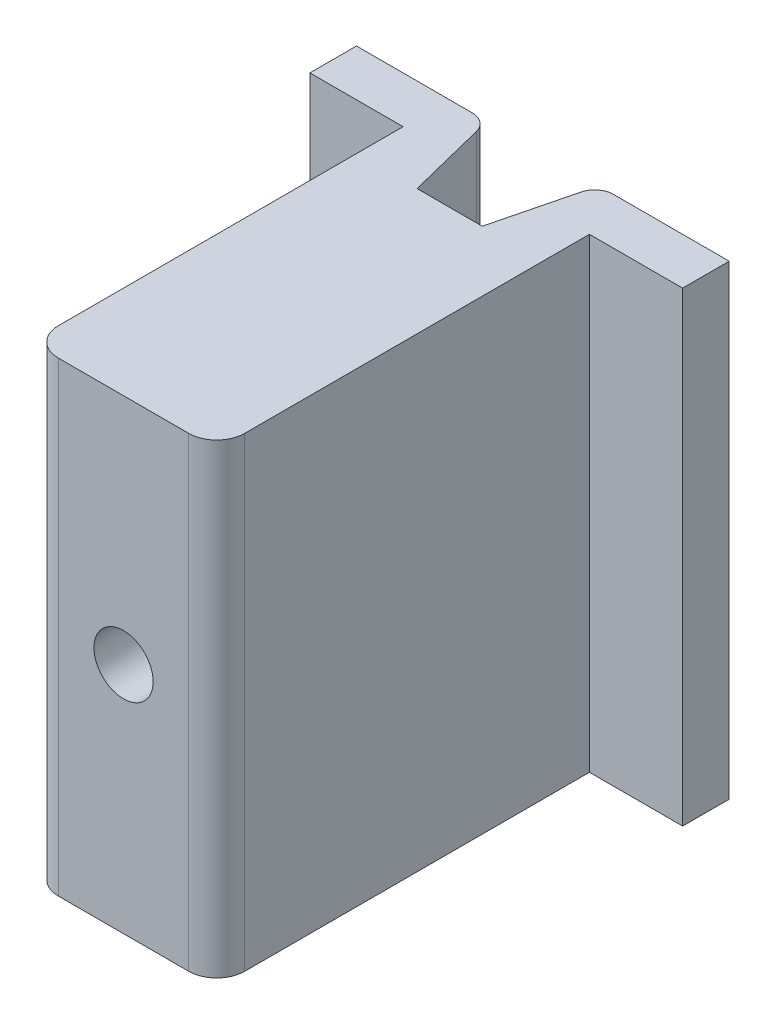
ISO-10303-21;
HEADER;
FILE_DESCRIPTION(('STEP AP214'),'2;1');
FILE_NAME('part.step','',(''),(''),'','','');
FILE_SCHEMA(('AUTOMOTIVE_DESIGN { 1 0 10303 214 1 1 1 1 }'));
ENDSEC;
DATA;
#1=APPLICATION_CONTEXT('core data for automotive mechanical design processes');
#2=APPLICATION_PROTOCOL_DEFINITION('international standard','automotive_design',2000,#1);
#3=PRODUCT_CONTEXT('',#1,'mechanical');
#4=PRODUCT('Part','Part','',(#3));
#5=PRODUCT_RELATED_PRODUCT_CATEGORY('part','',(#4));
#6=PRODUCT_DEFINITION_FORMATION('','',#4);
#7=PRODUCT_DEFINITION_CONTEXT('part definition',#1,'design');
#8=PRODUCT_DEFINITION('design','',#6,#7);
#9=PRODUCT_DEFINITION_SHAPE('','',#8);
#10=(LENGTH_UNIT() NAMED_UNIT(*) SI_UNIT(.MILLI.,.METRE.));
#11=(NAMED_UNIT(*) PLANE_ANGLE_UNIT() SI_UNIT($,.RADIAN.));
#12=(NAMED_UNIT(*) SI_UNIT($,.STERADIAN.) SOLID_ANGLE_UNIT());
#13=UNCERTAINTY_MEASURE_WITH_UNIT(LENGTH_MEASURE(1.E-05),#10,'distance_accuracy_value','');
#14=(GEOMETRIC_REPRESENTATION_CONTEXT(3) GLOBAL_UNCERTAINTY_ASSIGNED_CONTEXT((#13)) GLOBAL_UNIT_ASSIGNED_CONTEXT((#10,
#11,#12)) REPRESENTATION_CONTEXT('',''));
#15=CARTESIAN_POINT('',(0.,0.,0.));
#16=DIRECTION('',(0.,0.,1.));
#17=DIRECTION('',(1.,0.,0.));
#18=AXIS2_PLACEMENT_3D('',#15,#16,#17);
#19=CARTESIAN_POINT('',(0.,0.,0.));
#20=DIRECTION('',(0.,0.,-1.));
#21=DIRECTION('',(-1.,0.,0.));
#22=AXIS2_PLACEMENT_3D('',#19,#20,#21);
#23=PLANE('',#22);
#24=DIRECTION('',(1.,0.,0.));
#25=VECTOR('',#24,1.);
#26=CARTESIAN_POINT('',(-20.,-25.,0.));
#27=LINE('',#26,#25);
#28=CARTESIAN_POINT('',(7.56155281280883,-25.,0.));
#29=VERTEX_POINT('',#28);
#30=CARTESIAN_POINT('',(20.,-25.,0.));
#31=VERTEX_POINT('',#30);
#32=EDGE_CURVE('E252',#29,#31,#27,.T.);
#33=ORIENTED_EDGE('',*,*,#32,.F.);
#34=DIRECTION('',(0.,1.,0.));
#35=VECTOR('',#34,1.);
#36=CARTESIAN_POINT('',(7.56155281280883,25.,0.));
#37=LINE('',#36,#35);
#38=CARTESIAN_POINT('',(7.56155281280883,25.,0.));
#39=VERTEX_POINT('',#38);
#40=EDGE_CURVE('E271',#29,#39,#37,.T.);
#41=ORIENTED_EDGE('',*,*,#40,.T.);
#42=DIRECTION('',(-1.,0.,0.));
#43=VECTOR('',#42,1.);
#44=CARTESIAN_POINT('',(-20.,25.,0.));
#45=LINE('',#44,#43);
#46=CARTESIAN_POINT('',(20.,25.,0.));
#47=VERTEX_POINT('',#46);
#48=EDGE_CURVE('E245',#47,#39,#45,.T.);
#49=ORIENTED_EDGE('',*,*,#48,.F.);
#50=DIRECTION('',(0.,1.,0.));
#51=VECTOR('',#50,1.);
#52=CARTESIAN_POINT('',(20.,-25.,0.));
#53=LINE('',#52,#51);
#54=EDGE_CURVE('E221',#31,#47,#53,.T.);
#55=ORIENTED_EDGE('',*,*,#54,.F.);
#56=EDGE_LOOP('',(#33,#41,#49,#55));
#57=FACE_BOUND('',#56,.T.);
#58=ADVANCED_FACE('F39',(#57),#23,.T.);
#59=CARTESIAN_POINT('',(0.,0.,5.));
#60=DIRECTION('',(0.,0.,-1.));
#61=DIRECTION('',(-1.,0.,0.));
#62=AXIS2_PLACEMENT_3D('',#59,#60,#61);
#63=PLANE('',#62);
#64=DIRECTION('',(0.,1.,0.));
#65=VECTOR('',#64,1.);
#66=CARTESIAN_POINT('',(10.,-25.,5.));
#67=LINE('',#66,#65);
#68=CARTESIAN_POINT('',(10.,-25.,5.));
#69=VERTEX_POINT('',#68);
#70=CARTESIAN_POINT('',(10.,25.,5.));
#71=VERTEX_POINT('',#70);
#72=EDGE_CURVE('E193',#69,#71,#67,.T.);
#73=ORIENTED_EDGE('',*,*,#72,.F.);
#74=DIRECTION('',(1.,0.,0.));
#75=VECTOR('',#74,1.);
#76=CARTESIAN_POINT('',(-20.,-25.,5.));
#77=LINE('',#76,#75);
#78=CARTESIAN_POINT('',(20.,-25.,5.));
#79=VERTEX_POINT('',#78);
#80=EDGE_CURVE('E235',#69,#79,#77,.T.);
#81=ORIENTED_EDGE('',*,*,#80,.T.);
#82=DIRECTION('',(0.,1.,0.));
#83=VECTOR('',#82,1.);
#84=CARTESIAN_POINT('',(20.,-25.,5.));
#85=LINE('',#84,#83);
#86=CARTESIAN_POINT('',(20.,25.,5.));
#87=VERTEX_POINT('',#86);
#88=EDGE_CURVE('E222',#79,#87,#85,.T.);
#89=ORIENTED_EDGE('',*,*,#88,.T.);
#90=DIRECTION('',(-1.,0.,0.));
#91=VECTOR('',#90,1.);
#92=CARTESIAN_POINT('',(-20.,25.,5.));
#93=LINE('',#92,#91);
#94=EDGE_CURVE('E228',#87,#71,#93,.T.);
#95=ORIENTED_EDGE('',*,*,#94,.T.);
#96=EDGE_LOOP('',(#73,#81,#89,#95));
#97=FACE_BOUND('',#96,.T.);
#98=ADVANCED_FACE('F325',(#97),#63,.F.);
#99=DIRECTION('',(0.,-1.,0.));
#100=VECTOR('',#99,1.);
#101=CARTESIAN_POINT('',(-10.,-25.,5.));
#102=LINE('',#101,#100);
#103=CARTESIAN_POINT('',(-10.,25.,5.));
#104=VERTEX_POINT('',#103);
#105=CARTESIAN_POINT('',(-10.,-25.,5.));
#106=VERTEX_POINT('',#105);
#107=EDGE_CURVE('E199',#104,#106,#102,.T.);
#108=ORIENTED_EDGE('',*,*,#107,.F.);
#109=CARTESIAN_POINT('',(-20.,25.,5.));
#110=VERTEX_POINT('',#109);
#111=EDGE_CURVE('E226',#104,#110,#93,.T.);
#112=ORIENTED_EDGE('',*,*,#111,.T.);
#113=DIRECTION('',(0.,-1.,0.));
#114=VECTOR('',#113,1.);
#115=CARTESIAN_POINT('',(-20.,-25.,5.));
#116=LINE('',#115,#114);
#117=CARTESIAN_POINT('',(-20.,-25.,5.));
#118=VERTEX_POINT('',#117);
#119=EDGE_CURVE('E232',#110,#118,#116,.T.);
#120=ORIENTED_EDGE('',*,*,#119,.T.);
#121=EDGE_CURVE('E236',#118,#106,#77,.T.);
#122=ORIENTED_EDGE('',*,*,#121,.T.);
#123=EDGE_LOOP('',(#108,#112,#120,#122));
#124=FACE_BOUND('',#123,.T.);
#125=ADVANCED_FACE('F366',(#124),#63,.F.);
#126=CARTESIAN_POINT('',(20.,-25.,5.));
#127=DIRECTION('',(-1.,0.,0.));
#128=DIRECTION('',(0.,0.,1.));
#129=AXIS2_PLACEMENT_3D('',#126,#127,#128);
#130=PLANE('',#129);
#131=ORIENTED_EDGE('',*,*,#54,.T.);
#132=DIRECTION('',(0.,0.,-1.));
#133=VECTOR('',#132,1.);
#134=CARTESIAN_POINT('',(20.,25.,5.));
#135=LINE('',#134,#133);
#136=EDGE_CURVE('E267',#87,#47,#135,.T.);
#137=ORIENTED_EDGE('',*,*,#136,.F.);
#138=ORIENTED_EDGE('',*,*,#88,.F.);
#139=DIRECTION('',(0.,0.,-1.));
#140=VECTOR('',#139,1.);
#141=CARTESIAN_POINT('',(20.,-25.,5.));
#142=LINE('',#141,#140);
#143=EDGE_CURVE('E240',#79,#31,#142,.T.);
#144=ORIENTED_EDGE('',*,*,#143,.T.);
#145=EDGE_LOOP('',(#131,#137,#138,#144));
#146=FACE_BOUND('',#145,.T.);
#147=ADVANCED_FACE('F384',(#146),#130,.F.);
#148=CARTESIAN_POINT('',(-20.,25.,5.));
#149=DIRECTION('',(0.,-1.,0.));
#150=DIRECTION('',(0.,0.,-1.));
#151=AXIS2_PLACEMENT_3D('',#148,#149,#150);
#152=PLANE('',#151);
#153=DIRECTION('',(-1.,0.,0.));
#154=VECTOR('',#153,1.);
#155=CARTESIAN_POINT('',(-10.,25.,45.));
#156=LINE('',#155,#154);
#157=CARTESIAN_POINT('',(7.,25.,45.));
#158=VERTEX_POINT('',#157);
#159=CARTESIAN_POINT('',(-7.,25.,45.));
#160=VERTEX_POINT('',#159);
#161=EDGE_CURVE('E194',#158,#160,#156,.T.);
#162=ORIENTED_EDGE('',*,*,#161,.F.);
#163=CARTESIAN_POINT('',(7.00000000000001,25.,42.));
#164=DIRECTION('',(0.,-1.,0.));
#165=DIRECTION('',(0.,0.,-1.));
#166=AXIS2_PLACEMENT_3D('',#163,#164,#165);
#167=CIRCLE('',#166,3.);
#168=CARTESIAN_POINT('',(10.,25.,42.));
#169=VERTEX_POINT('',#168);
#170=EDGE_CURVE('E306',#158,#169,#167,.F.);
#171=ORIENTED_EDGE('',*,*,#170,.T.);
#172=DIRECTION('',(0.,0.,-1.));
#173=VECTOR('',#172,1.);
#174=CARTESIAN_POINT('',(10.,25.,45.));
#175=LINE('',#174,#173);
#176=EDGE_CURVE('E218',#169,#71,#175,.T.);
#177=ORIENTED_EDGE('',*,*,#176,.T.);
#178=ORIENTED_EDGE('',*,*,#94,.F.);
#179=ORIENTED_EDGE('',*,*,#136,.T.);
#180=ORIENTED_EDGE('',*,*,#48,.T.);
#181=CARTESIAN_POINT('',(7.56155281280883,25.,2.));
#182=DIRECTION('',(0.,-1.,0.));
#183=DIRECTION('',(0.,0.,-1.));
#184=AXIS2_PLACEMENT_3D('',#181,#182,#183);
#185=CIRCLE('',#184,2.);
#186=CARTESIAN_POINT('',(5.62126781251817,25.,1.51492874992733));
#187=VERTEX_POINT('',#186);
#188=EDGE_CURVE('E278',#39,#187,#185,.F.);
#189=ORIENTED_EDGE('',*,*,#188,.T.);
#190=DIRECTION('',(0.242535625036333,0.,-0.970142500145332));
#191=VECTOR('',#190,1.);
#192=CARTESIAN_POINT('',(3.5,25.,10.));
#193=LINE('',#192,#191);
#194=CARTESIAN_POINT('',(3.5,25.,10.));
#195=VERTEX_POINT('',#194);
#196=EDGE_CURVE('E177',#195,#187,#193,.T.);
#197=ORIENTED_EDGE('',*,*,#196,.F.);
#198=DIRECTION('',(1.,0.,0.));
#199=VECTOR('',#198,1.);
#200=CARTESIAN_POINT('',(-3.5,25.,10.));
#201=LINE('',#200,#199);
#202=CARTESIAN_POINT('',(-3.5,25.,10.));
#203=VERTEX_POINT('',#202);
#204=EDGE_CURVE('E164',#203,#195,#201,.T.);
#205=ORIENTED_EDGE('',*,*,#204,.F.);
#206=DIRECTION('',(0.242535625036333,0.,0.970142500145332));
#207=VECTOR('',#206,1.);
#208=CARTESIAN_POINT('',(-6.,25.,0.));
#209=LINE('',#208,#207);
#210=CARTESIAN_POINT('',(-5.62126781251817,25.,1.51492874992733));
#211=VERTEX_POINT('',#210);
#212=EDGE_CURVE('E153',#211,#203,#209,.T.);
#213=ORIENTED_EDGE('',*,*,#212,.F.);
#214=CARTESIAN_POINT('',(-7.56155281280883,25.,2.));
#215=DIRECTION('',(0.,-1.,0.));
#216=DIRECTION('',(0.,0.,-1.));
#217=AXIS2_PLACEMENT_3D('',#214,#215,#216);
#218=CIRCLE('',#217,2.);
#219=CARTESIAN_POINT('',(-7.56155281280883,25.,0.));
#220=VERTEX_POINT('',#219);
#221=EDGE_CURVE('E275',#211,#220,#218,.F.);
#222=ORIENTED_EDGE('',*,*,#221,.T.);
#223=CARTESIAN_POINT('',(-20.,25.,0.));
#224=VERTEX_POINT('',#223);
#225=EDGE_CURVE('E244',#220,#224,#45,.T.);
#226=ORIENTED_EDGE('',*,*,#225,.T.);
#227=DIRECTION('',(0.,0.,-1.));
#228=VECTOR('',#227,1.);
#229=CARTESIAN_POINT('',(-20.,25.,5.));
#230=LINE('',#229,#228);
#231=EDGE_CURVE('E263',#110,#224,#230,.T.);
#232=ORIENTED_EDGE('',*,*,#231,.F.);
#233=ORIENTED_EDGE('',*,*,#111,.F.);
#234=DIRECTION('',(0.,0.,-1.));
#235=VECTOR('',#234,1.);
#236=CARTESIAN_POINT('',(-10.,25.,45.));
#237=LINE('',#236,#235);
#238=CARTESIAN_POINT('',(-10.,25.,42.));
#239=VERTEX_POINT('',#238);
#240=EDGE_CURVE('E215',#239,#104,#237,.T.);
#241=ORIENTED_EDGE('',*,*,#240,.F.);
#242=CARTESIAN_POINT('',(-7.,25.,42.));
#243=DIRECTION('',(0.,-1.,0.));
#244=DIRECTION('',(0.,0.,-1.));
#245=AXIS2_PLACEMENT_3D('',#242,#243,#244);
#246=CIRCLE('',#245,3.);
#247=EDGE_CURVE('E303',#239,#160,#246,.F.);
#248=ORIENTED_EDGE('',*,*,#247,.T.);
#249=EDGE_LOOP('',(#162,#171,#177,#178,#179,#180,#189,#197,#205,#213,#222,#226,#232,#233,#241,#248));
#250=FACE_BOUND('',#249,.T.);
#251=ADVANCED_FACE('F180',(#250),#152,.F.);
#252=CARTESIAN_POINT('',(-20.,-25.,5.));
#253=DIRECTION('',(1.,0.,0.));
#254=DIRECTION('',(0.,0.,-1.));
#255=AXIS2_PLACEMENT_3D('',#252,#253,#254);
#256=PLANE('',#255);
#257=DIRECTION('',(0.,-1.,0.));
#258=VECTOR('',#257,1.);
#259=CARTESIAN_POINT('',(-20.,-25.,0.));
#260=LINE('',#259,#258);
#261=CARTESIAN_POINT('',(-20.,-25.,0.));
#262=VERTEX_POINT('',#261);
#263=EDGE_CURVE('E249',#224,#262,#260,.T.);
#264=ORIENTED_EDGE('',*,*,#263,.T.);
#265=DIRECTION('',(0.,0.,-1.));
#266=VECTOR('',#265,1.);
#267=CARTESIAN_POINT('',(-20.,-25.,5.));
#268=LINE('',#267,#266);
#269=EDGE_CURVE('E259',#118,#262,#268,.T.);
#270=ORIENTED_EDGE('',*,*,#269,.F.);
#271=ORIENTED_EDGE('',*,*,#119,.F.);
#272=ORIENTED_EDGE('',*,*,#231,.T.);
#273=EDGE_LOOP('',(#264,#270,#271,#272));
#274=FACE_BOUND('',#273,.T.);
#275=ADVANCED_FACE('F340',(#274),#256,.F.);
#276=CARTESIAN_POINT('',(-20.,-25.,5.));
#277=DIRECTION('',(0.,1.,0.));
#278=DIRECTION('',(0.,0.,1.));
#279=AXIS2_PLACEMENT_3D('',#276,#277,#278);
#280=PLANE('',#279);
#281=DIRECTION('',(0.,0.,-1.));
#282=VECTOR('',#281,1.);
#283=CARTESIAN_POINT('',(10.,-25.,45.));
#284=LINE('',#283,#282);
#285=CARTESIAN_POINT('',(10.,-25.,42.));
#286=VERTEX_POINT('',#285);
#287=EDGE_CURVE('E203',#286,#69,#284,.T.);
#288=ORIENTED_EDGE('',*,*,#287,.F.);
#289=CARTESIAN_POINT('',(7.00000000000001,-25.,42.));
#290=DIRECTION('',(0.,1.,0.));
#291=DIRECTION('',(0.,0.,1.));
#292=AXIS2_PLACEMENT_3D('',#289,#290,#291);
#293=CIRCLE('',#292,3.);
#294=CARTESIAN_POINT('',(7.,-25.,45.));
#295=VERTEX_POINT('',#294);
#296=EDGE_CURVE('E48',#286,#295,#293,.F.);
#297=ORIENTED_EDGE('',*,*,#296,.T.);
#298=DIRECTION('',(1.,0.,0.));
#299=VECTOR('',#298,1.);
#300=CARTESIAN_POINT('',(-10.,-25.,45.));
#301=LINE('',#300,#299);
#302=CARTESIAN_POINT('',(-7.,-25.,45.));
#303=VERTEX_POINT('',#302);
#304=EDGE_CURVE('E198',#303,#295,#301,.T.);
#305=ORIENTED_EDGE('',*,*,#304,.F.);
#306=CARTESIAN_POINT('',(-7.,-25.,42.));
#307=DIRECTION('',(0.,1.,0.));
#308=DIRECTION('',(0.,0.,1.));
#309=AXIS2_PLACEMENT_3D('',#306,#307,#308);
#310=CIRCLE('',#309,3.);
#311=CARTESIAN_POINT('',(-10.,-25.,42.));
#312=VERTEX_POINT('',#311);
#313=EDGE_CURVE('E55',#303,#312,#310,.F.);
#314=ORIENTED_EDGE('',*,*,#313,.T.);
#315=DIRECTION('',(0.,0.,-1.));
#316=VECTOR('',#315,1.);
#317=CARTESIAN_POINT('',(-10.,-25.,45.));
#318=LINE('',#317,#316);
#319=EDGE_CURVE('E212',#312,#106,#318,.T.);
#320=ORIENTED_EDGE('',*,*,#319,.T.);
#321=ORIENTED_EDGE('',*,*,#121,.F.);
#322=ORIENTED_EDGE('',*,*,#269,.T.);
#323=CARTESIAN_POINT('',(-7.56155281280883,-25.,0.));
#324=VERTEX_POINT('',#323);
#325=EDGE_CURVE('E227',#262,#324,#27,.T.);
#326=ORIENTED_EDGE('',*,*,#325,.T.);
#327=CARTESIAN_POINT('',(-7.56155281280883,-25.,2.));
#328=DIRECTION('',(0.,1.,0.));
#329=DIRECTION('',(0.,0.,1.));
#330=AXIS2_PLACEMENT_3D('',#327,#328,#329);
#331=CIRCLE('',#330,2.);
#332=CARTESIAN_POINT('',(-5.62126781251817,-25.,1.51492874992733));
#333=VERTEX_POINT('',#332);
#334=EDGE_CURVE('E284',#324,#333,#331,.F.);
#335=ORIENTED_EDGE('',*,*,#334,.T.);
#336=DIRECTION('',(-0.242535625036333,0.,-0.970142500145332));
#337=VECTOR('',#336,1.);
#338=CARTESIAN_POINT('',(-6.,-25.,0.));
#339=LINE('',#338,#337);
#340=CARTESIAN_POINT('',(-3.5,-25.,10.));
#341=VERTEX_POINT('',#340);
#342=EDGE_CURVE('E189',#341,#333,#339,.T.);
#343=ORIENTED_EDGE('',*,*,#342,.F.);
#344=DIRECTION('',(-1.,0.,0.));
#345=VECTOR('',#344,1.);
#346=CARTESIAN_POINT('',(-3.5,-25.,10.));
#347=LINE('',#346,#345);
#348=CARTESIAN_POINT('',(3.5,-25.,10.));
#349=VERTEX_POINT('',#348);
#350=EDGE_CURVE('E173',#349,#341,#347,.T.);
#351=ORIENTED_EDGE('',*,*,#350,.F.);
#352=DIRECTION('',(-0.242535625036334,0.,0.970142500145332));
#353=VECTOR('',#352,1.);
#354=CARTESIAN_POINT('',(3.5,-25.,10.));
#355=LINE('',#354,#353);
#356=CARTESIAN_POINT('',(5.62126781251817,-25.,1.51492874992733));
#357=VERTEX_POINT('',#356);
#358=EDGE_CURVE('E165',#357,#349,#355,.T.);
#359=ORIENTED_EDGE('',*,*,#358,.F.);
#360=CARTESIAN_POINT('',(7.56155281280883,-25.,2.));
#361=DIRECTION('',(0.,1.,0.));
#362=DIRECTION('',(0.,0.,1.));
#363=AXIS2_PLACEMENT_3D('',#360,#361,#362);
#364=CIRCLE('',#363,2.);
#365=EDGE_CURVE('E287',#357,#29,#364,.F.);
#366=ORIENTED_EDGE('',*,*,#365,.T.);
#367=ORIENTED_EDGE('',*,*,#32,.T.);
#368=ORIENTED_EDGE('',*,*,#143,.F.);
#369=ORIENTED_EDGE('',*,*,#80,.F.);
#370=EDGE_LOOP('',(#288,#297,#305,#314,#320,#321,#322,#326,#335,#343,#351,#359,#366,#367,#368,#369));
#371=FACE_BOUND('',#370,.T.);
#372=ADVANCED_FACE('F314',(#371),#280,.F.);
#373=ORIENTED_EDGE('',*,*,#225,.F.);
#374=DIRECTION('',(0.,1.,0.));
#375=VECTOR('',#374,1.);
#376=CARTESIAN_POINT('',(-7.56155281280883,-25.,0.));
#377=LINE('',#376,#375);
#378=EDGE_CURVE('E292',#220,#324,#377,.F.);
#379=ORIENTED_EDGE('',*,*,#378,.T.);
#380=ORIENTED_EDGE('',*,*,#325,.F.);
#381=ORIENTED_EDGE('',*,*,#263,.F.);
#382=EDGE_LOOP('',(#373,#379,#380,#381));
#383=FACE_BOUND('',#382,.T.);
#384=ADVANCED_FACE('F343',(#383),#23,.T.);
#385=CARTESIAN_POINT('',(10.,-25.,45.));
#386=DIRECTION('',(-1.,0.,0.));
#387=DIRECTION('',(0.,0.,1.));
#388=AXIS2_PLACEMENT_3D('',#385,#386,#387);
#389=PLANE('',#388);
#390=ORIENTED_EDGE('',*,*,#176,.F.);
#391=DIRECTION('',(0.,1.,0.));
#392=VECTOR('',#391,1.);
#393=CARTESIAN_POINT('',(10.,-25.,42.));
#394=LINE('',#393,#392);
#395=EDGE_CURVE('E63',#169,#286,#394,.F.);
#396=ORIENTED_EDGE('',*,*,#395,.T.);
#397=ORIENTED_EDGE('',*,*,#287,.T.);
#398=ORIENTED_EDGE('',*,*,#72,.T.);
#399=EDGE_LOOP('',(#390,#396,#397,#398));
#400=FACE_BOUND('',#399,.T.);
#401=ADVANCED_FACE('F322',(#400),#389,.F.);
#402=CARTESIAN_POINT('',(-10.,-25.,45.));
#403=DIRECTION('',(1.,0.,0.));
#404=DIRECTION('',(0.,0.,-1.));
#405=AXIS2_PLACEMENT_3D('',#402,#403,#404);
#406=PLANE('',#405);
#407=ORIENTED_EDGE('',*,*,#319,.F.);
#408=DIRECTION('',(0.,-1.,0.));
#409=VECTOR('',#408,1.);
#410=CARTESIAN_POINT('',(-10.,-25.,42.));
#411=LINE('',#410,#409);
#412=EDGE_CURVE('E11',#312,#239,#411,.F.);
#413=ORIENTED_EDGE('',*,*,#412,.T.);
#414=ORIENTED_EDGE('',*,*,#240,.T.);
#415=ORIENTED_EDGE('',*,*,#107,.T.);
#416=EDGE_LOOP('',(#407,#413,#414,#415));
#417=FACE_BOUND('',#416,.T.);
#418=ADVANCED_FACE('F375',(#417),#406,.F.);
#419=CARTESIAN_POINT('',(0.,0.,45.));
#420=DIRECTION('',(0.,0.,-1.));
#421=DIRECTION('',(-1.,0.,0.));
#422=AXIS2_PLACEMENT_3D('',#419,#420,#421);
#423=PLANE('',#422);
#424=CARTESIAN_POINT('',(0.,0.,45.));
#425=DIRECTION('',(0.,0.,1.));
#426=DIRECTION('',(1.,0.,0.));
#427=AXIS2_PLACEMENT_3D('',#424,#425,#426);
#428=CIRCLE('',#427,3.175);
#429=CARTESIAN_POINT('',(3.175,0.,45.));
#430=VERTEX_POINT('',#429);
#431=EDGE_CURVE('E407',#430,#430,#428,.T.);
#432=ORIENTED_EDGE('',*,*,#431,.F.);
#433=EDGE_LOOP('',(#432));
#434=FACE_BOUND('',#433,.T.);
#435=ORIENTED_EDGE('',*,*,#304,.T.);
#436=DIRECTION('',(0.,1.,0.));
#437=VECTOR('',#436,1.);
#438=CARTESIAN_POINT('',(7.00000000000001,0.,45.));
#439=LINE('',#438,#437);
#440=EDGE_CURVE('E299',#295,#158,#439,.T.);
#441=ORIENTED_EDGE('',*,*,#440,.T.);
#442=ORIENTED_EDGE('',*,*,#161,.T.);
#443=DIRECTION('',(0.,-1.,0.));
#444=VECTOR('',#443,1.);
#445=CARTESIAN_POINT('',(-7.,0.,45.));
#446=LINE('',#445,#444);
#447=EDGE_CURVE('E295',#160,#303,#446,.T.);
#448=ORIENTED_EDGE('',*,*,#447,.T.);
#449=EDGE_LOOP('',(#435,#441,#442,#448));
#450=FACE_BOUND('',#449,.T.);
#451=ADVANCED_FACE('F319',(#434,#450),#423,.F.);
#452=CARTESIAN_POINT('',(3.5,-25.001,10.));
#453=DIRECTION('',(0.970142500145332,0.,0.242535625036333));
#454=DIRECTION('',(0.242535625036334,0.,-0.970142500145332));
#455=AXIS2_PLACEMENT_3D('',#452,#453,#454);
#456=PLANE('',#455);
#457=ORIENTED_EDGE('',*,*,#196,.T.);
#458=DIRECTION('',(0.,1.,0.));
#459=VECTOR('',#458,1.);
#460=CARTESIAN_POINT('',(5.62126781251817,-25.,1.51492874992733));
#461=LINE('',#460,#459);
#462=EDGE_CURVE('E281',#187,#357,#461,.F.);
#463=ORIENTED_EDGE('',*,*,#462,.T.);
#464=ORIENTED_EDGE('',*,*,#358,.T.);
#465=DIRECTION('',(0.,1.,0.));
#466=VECTOR('',#465,1.);
#467=CARTESIAN_POINT('',(3.5,-25.001,10.));
#468=LINE('',#467,#466);
#469=EDGE_CURVE('E176',#349,#195,#468,.T.);
#470=ORIENTED_EDGE('',*,*,#469,.T.);
#471=EDGE_LOOP('',(#457,#463,#464,#470));
#472=FACE_BOUND('',#471,.T.);
#473=ADVANCED_FACE('F396',(#472),#456,.F.);
#474=CARTESIAN_POINT('',(-3.5,-25.001,10.));
#475=DIRECTION('',(0.,0.,1.));
#476=DIRECTION('',(1.,0.,0.));
#477=AXIS2_PLACEMENT_3D('',#474,#475,#476);
#478=PLANE('',#477);
#479=CARTESIAN_POINT('',(0.,0.,10.));
#480=DIRECTION('',(0.,0.,1.));
#481=DIRECTION('',(1.,0.,0.));
#482=AXIS2_PLACEMENT_3D('',#479,#480,#481);
#483=CIRCLE('',#482,3.175);
#484=CARTESIAN_POINT('',(3.175,0.,10.));
#485=VERTEX_POINT('',#484);
#486=EDGE_CURVE('E401',#485,#485,#483,.F.);
#487=ORIENTED_EDGE('',*,*,#486,.F.);
#488=EDGE_LOOP('',(#487));
#489=FACE_BOUND('',#488,.T.);
#490=ORIENTED_EDGE('',*,*,#350,.T.);
#491=DIRECTION('',(0.,1.,0.));
#492=VECTOR('',#491,1.);
#493=CARTESIAN_POINT('',(-3.5,-25.001,10.));
#494=LINE('',#493,#492);
#495=EDGE_CURVE('E157',#341,#203,#494,.T.);
#496=ORIENTED_EDGE('',*,*,#495,.T.);
#497=ORIENTED_EDGE('',*,*,#204,.T.);
#498=ORIENTED_EDGE('',*,*,#469,.F.);
#499=EDGE_LOOP('',(#490,#496,#497,#498));
#500=FACE_BOUND('',#499,.T.);
#501=ADVANCED_FACE('F169',(#489,#500),#478,.F.);
#502=CARTESIAN_POINT('',(-6.,-25.001,0.));
#503=DIRECTION('',(-0.970142500145332,0.,0.242535625036333));
#504=DIRECTION('',(0.242535625036333,0.,0.970142500145332));
#505=AXIS2_PLACEMENT_3D('',#502,#503,#504);
#506=PLANE('',#505);
#507=ORIENTED_EDGE('',*,*,#342,.T.);
#508=DIRECTION('',(0.,1.,0.));
#509=VECTOR('',#508,1.);
#510=CARTESIAN_POINT('',(-5.62126781251817,25.,1.51492874992733));
#511=LINE('',#510,#509);
#512=EDGE_CURVE('E160',#333,#211,#511,.T.);
#513=ORIENTED_EDGE('',*,*,#512,.T.);
#514=ORIENTED_EDGE('',*,*,#212,.T.);
#515=ORIENTED_EDGE('',*,*,#495,.F.);
#516=EDGE_LOOP('',(#507,#513,#514,#515));
#517=FACE_BOUND('',#516,.T.);
#518=ADVANCED_FACE('F156',(#517),#506,.F.);
#519=CARTESIAN_POINT('',(7.56155281280883,0.,2.));
#520=DIRECTION('',(0.,-1.,0.));
#521=DIRECTION('',(0.,0.,-1.));
#522=AXIS2_PLACEMENT_3D('',#519,#520,#521);
#523=CYLINDRICAL_SURFACE('',#522,2.);
#524=ORIENTED_EDGE('',*,*,#365,.F.);
#525=ORIENTED_EDGE('',*,*,#462,.F.);
#526=ORIENTED_EDGE('',*,*,#188,.F.);
#527=ORIENTED_EDGE('',*,*,#40,.F.);
#528=EDGE_LOOP('',(#524,#525,#526,#527));
#529=FACE_BOUND('',#528,.T.);
#530=ADVANCED_FACE('F350',(#529),#523,.T.);
#531=CARTESIAN_POINT('',(-7.56155281280883,-25.001,2.));
#532=DIRECTION('',(0.,-1.,0.));
#533=DIRECTION('',(0.,0.,-1.));
#534=AXIS2_PLACEMENT_3D('',#531,#532,#533);
#535=CYLINDRICAL_SURFACE('',#534,2.);
#536=ORIENTED_EDGE('',*,*,#334,.F.);
#537=ORIENTED_EDGE('',*,*,#378,.F.);
#538=ORIENTED_EDGE('',*,*,#221,.F.);
#539=ORIENTED_EDGE('',*,*,#512,.F.);
#540=EDGE_LOOP('',(#536,#537,#538,#539));
#541=FACE_BOUND('',#540,.T.);
#542=ADVANCED_FACE('F347',(#541),#535,.T.);
#543=CARTESIAN_POINT('',(0.,0.,-0.001000000000001));
#544=DIRECTION('',(0.,0.,1.));
#545=DIRECTION('',(1.,0.,0.));
#546=AXIS2_PLACEMENT_3D('',#543,#544,#545);
#547=CYLINDRICAL_SURFACE('',#546,3.175);
#548=ORIENTED_EDGE('',*,*,#431,.T.);
#549=EDGE_LOOP('',(#548));
#550=FACE_BOUND('',#549,.T.);
#551=ORIENTED_EDGE('',*,*,#486,.T.);
#552=EDGE_LOOP('',(#551));
#553=FACE_BOUND('',#552,.T.);
#554=ADVANCED_FACE('F349',(#550,#553),#547,.F.);
#555=CARTESIAN_POINT('',(7.00000000000001,0.,42.));
#556=DIRECTION('',(0.,1.,0.));
#557=DIRECTION('',(0.,0.,1.));
#558=AXIS2_PLACEMENT_3D('',#555,#556,#557);
#559=CYLINDRICAL_SURFACE('',#558,3.);
#560=ORIENTED_EDGE('',*,*,#296,.F.);
#561=ORIENTED_EDGE('',*,*,#395,.F.);
#562=ORIENTED_EDGE('',*,*,#170,.F.);
#563=ORIENTED_EDGE('',*,*,#440,.F.);
#564=EDGE_LOOP('',(#560,#561,#562,#563));
#565=FACE_BOUND('',#564,.T.);
#566=ADVANCED_FACE('F321',(#565),#559,.T.);
#567=CARTESIAN_POINT('',(-7.,0.,42.));
#568=DIRECTION('',(0.,-1.,0.));
#569=DIRECTION('',(0.,0.,-1.));
#570=AXIS2_PLACEMENT_3D('',#567,#568,#569);
#571=CYLINDRICAL_SURFACE('',#570,3.);
#572=ORIENTED_EDGE('',*,*,#247,.F.);
#573=ORIENTED_EDGE('',*,*,#412,.F.);
#574=ORIENTED_EDGE('',*,*,#313,.F.);
#575=ORIENTED_EDGE('',*,*,#447,.F.);
#576=EDGE_LOOP('',(#572,#573,#574,#575));
#577=FACE_BOUND('',#576,.T.);
#578=ADVANCED_FACE('F41',(#577),#571,.T.);
#579=CLOSED_SHELL('',(#58,#98,#125,#147,#251,#275,#372,#384,#401,#418,#451,#473,#501,#518,#530,
#542,#554,#566,#578));
#580=MANIFOLD_SOLID_BREP('B2',#579);
#581=ADVANCED_BREP_SHAPE_REPRESENTATION('',(#18,#580),#14);
#582=SHAPE_DEFINITION_REPRESENTATION(#9,#581);
ENDSEC;
END-ISO-10303-21;
